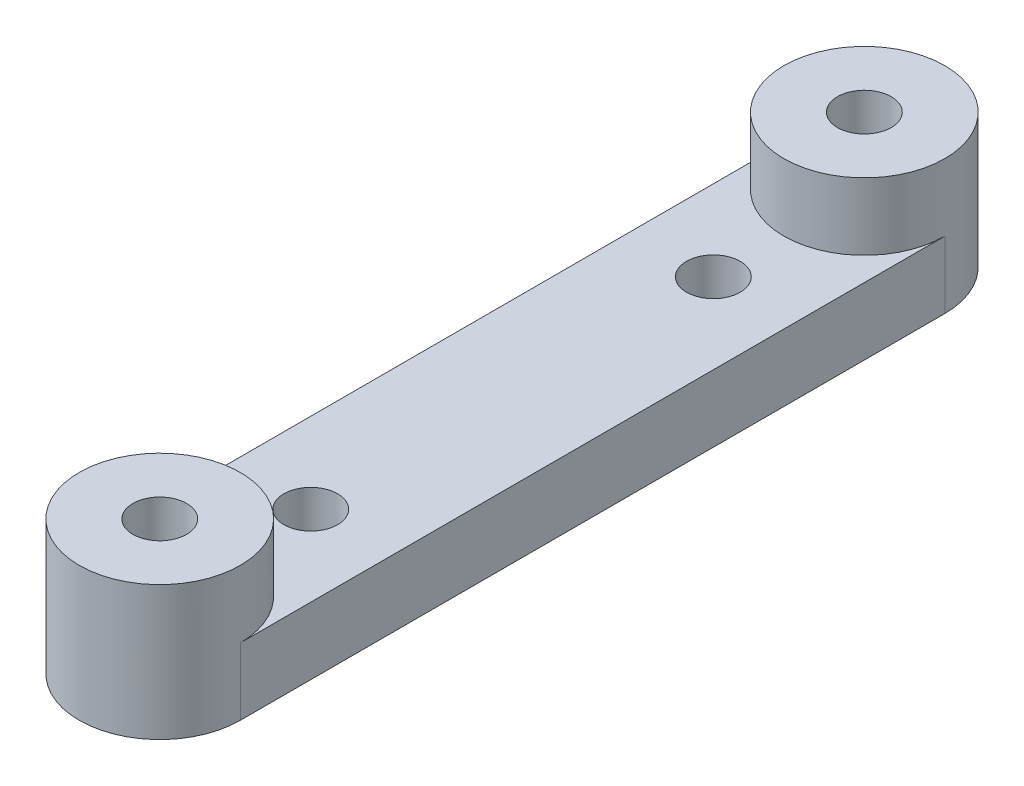
ISO-10303-21;
HEADER;
FILE_DESCRIPTION(('STEP AP214'),'2;1');
FILE_NAME('part.step','',(''),(''),'','','');
FILE_SCHEMA(('AUTOMOTIVE_DESIGN { 1 0 10303 214 1 1 1 1 }'));
ENDSEC;
DATA;
#1=APPLICATION_CONTEXT('core data for automotive mechanical design processes');
#2=APPLICATION_PROTOCOL_DEFINITION('international standard','automotive_design',2000,#1);
#3=PRODUCT_CONTEXT('',#1,'mechanical');
#4=PRODUCT('Part','Part','',(#3));
#5=PRODUCT_RELATED_PRODUCT_CATEGORY('part','',(#4));
#6=PRODUCT_DEFINITION_FORMATION('','',#4);
#7=PRODUCT_DEFINITION_CONTEXT('part definition',#1,'design');
#8=PRODUCT_DEFINITION('design','',#6,#7);
#9=PRODUCT_DEFINITION_SHAPE('','',#8);
#10=(LENGTH_UNIT() NAMED_UNIT(*) SI_UNIT(.MILLI.,.METRE.));
#11=(NAMED_UNIT(*) PLANE_ANGLE_UNIT() SI_UNIT($,.RADIAN.));
#12=(NAMED_UNIT(*) SI_UNIT($,.STERADIAN.) SOLID_ANGLE_UNIT());
#13=UNCERTAINTY_MEASURE_WITH_UNIT(LENGTH_MEASURE(1.E-05),#10,'distance_accuracy_value','');
#14=(GEOMETRIC_REPRESENTATION_CONTEXT(3) GLOBAL_UNCERTAINTY_ASSIGNED_CONTEXT((#13)) GLOBAL_UNIT_ASSIGNED_CONTEXT((#10,
#11,#12)) REPRESENTATION_CONTEXT('',''));
#15=CARTESIAN_POINT('',(0.,0.,0.));
#16=DIRECTION('',(0.,0.,1.));
#17=DIRECTION('',(1.,0.,0.));
#18=AXIS2_PLACEMENT_3D('',#15,#16,#17);
#19=CARTESIAN_POINT('',(0.,0.,-26.25));
#20=DIRECTION('',(0.,1.,0.));
#21=DIRECTION('',(0.,0.,1.));
#22=AXIS2_PLACEMENT_3D('',#19,#20,#21);
#23=CYLINDRICAL_SURFACE('',#22,2.);
#24=CARTESIAN_POINT('',(0.,10.,-26.25));
#25=DIRECTION('',(0.,1.,0.));
#26=DIRECTION('',(0.,0.,1.));
#27=AXIS2_PLACEMENT_3D('',#24,#25,#26);
#28=CIRCLE('',#27,2.);
#29=CARTESIAN_POINT('',(0.,10.,-24.25));
#30=VERTEX_POINT('',#29);
#31=EDGE_CURVE('E264',#30,#30,#28,.T.);
#32=ORIENTED_EDGE('',*,*,#31,.T.);
#33=EDGE_LOOP('',(#32));
#34=FACE_BOUND('',#33,.T.);
#35=CARTESIAN_POINT('',(0.,2.5,-26.25));
#36=DIRECTION('',(0.,-1.,0.));
#37=DIRECTION('',(0.,0.,-1.));
#38=AXIS2_PLACEMENT_3D('',#35,#36,#37);
#39=CIRCLE('',#38,2.);
#40=CARTESIAN_POINT('',(0.,2.5,-28.25));
#41=VERTEX_POINT('',#40);
#42=EDGE_CURVE('E36',#41,#41,#39,.F.);
#43=ORIENTED_EDGE('',*,*,#42,.F.);
#44=EDGE_LOOP('',(#43));
#45=FACE_BOUND('',#44,.T.);
#46=ADVANCED_FACE('F32',(#34,#45),#23,.F.);
#47=CARTESIAN_POINT('',(0.,0.,26.25));
#48=DIRECTION('',(0.,1.,0.));
#49=DIRECTION('',(0.,0.,1.));
#50=AXIS2_PLACEMENT_3D('',#47,#48,#49);
#51=CYLINDRICAL_SURFACE('',#50,2.);
#52=CARTESIAN_POINT('',(0.,10.,26.25));
#53=DIRECTION('',(0.,1.,0.));
#54=DIRECTION('',(0.,0.,1.));
#55=AXIS2_PLACEMENT_3D('',#52,#53,#54);
#56=CIRCLE('',#55,2.);
#57=CARTESIAN_POINT('',(0.,10.,28.25));
#58=VERTEX_POINT('',#57);
#59=EDGE_CURVE('E280',#58,#58,#56,.T.);
#60=ORIENTED_EDGE('',*,*,#59,.T.);
#61=EDGE_LOOP('',(#60));
#62=FACE_BOUND('',#61,.T.);
#63=CARTESIAN_POINT('',(0.,2.5,26.25));
#64=DIRECTION('',(0.,-1.,0.));
#65=DIRECTION('',(0.,0.,-1.));
#66=AXIS2_PLACEMENT_3D('',#63,#64,#65);
#67=CIRCLE('',#66,2.);
#68=CARTESIAN_POINT('',(0.,2.5,24.25));
#69=VERTEX_POINT('',#68);
#70=EDGE_CURVE('E208',#69,#69,#67,.F.);
#71=ORIENTED_EDGE('',*,*,#70,.F.);
#72=EDGE_LOOP('',(#71));
#73=FACE_BOUND('',#72,.T.);
#74=ADVANCED_FACE('F328',(#62,#73),#51,.F.);
#75=CARTESIAN_POINT('',(0.,5.,0.));
#76=DIRECTION('',(0.,-1.,0.));
#77=DIRECTION('',(0.,0.,-1.));
#78=AXIS2_PLACEMENT_3D('',#75,#76,#77);
#79=PLANE('',#78);
#80=CARTESIAN_POINT('',(0.,5.,-15.));
#81=DIRECTION('',(0.,1.,0.));
#82=DIRECTION('',(0.,0.,1.));
#83=AXIS2_PLACEMENT_3D('',#80,#81,#82);
#84=CIRCLE('',#83,2.);
#85=CARTESIAN_POINT('',(0.,5.,-13.));
#86=VERTEX_POINT('',#85);
#87=EDGE_CURVE('E265',#86,#86,#84,.T.);
#88=ORIENTED_EDGE('',*,*,#87,.F.);
#89=EDGE_LOOP('',(#88));
#90=FACE_BOUND('',#89,.T.);
#91=CARTESIAN_POINT('',(0.,5.,15.));
#92=DIRECTION('',(0.,1.,0.));
#93=DIRECTION('',(0.,0.,1.));
#94=AXIS2_PLACEMENT_3D('',#91,#92,#93);
#95=CIRCLE('',#94,2.);
#96=CARTESIAN_POINT('',(0.,5.,17.));
#97=VERTEX_POINT('',#96);
#98=EDGE_CURVE('E271',#97,#97,#95,.T.);
#99=ORIENTED_EDGE('',*,*,#98,.F.);
#100=EDGE_LOOP('',(#99));
#101=FACE_BOUND('',#100,.T.);
#102=CARTESIAN_POINT('',(0.,5.,-26.25));
#103=DIRECTION('',(0.,1.,0.));
#104=DIRECTION('',(0.,0.,1.));
#105=AXIS2_PLACEMENT_3D('',#102,#103,#104);
#106=CIRCLE('',#105,6.);
#107=CARTESIAN_POINT('',(-6.00000000000001,5.,-26.25));
#108=VERTEX_POINT('',#107);
#109=CARTESIAN_POINT('',(6.,5.,-26.25));
#110=VERTEX_POINT('',#109);
#111=EDGE_CURVE('E276',#108,#110,#106,.T.);
#112=ORIENTED_EDGE('',*,*,#111,.F.);
#113=DIRECTION('',(0.,0.,1.));
#114=VECTOR('',#113,1.);
#115=CARTESIAN_POINT('',(-6.,5.,32.25));
#116=LINE('',#115,#114);
#117=CARTESIAN_POINT('',(-6.,5.,26.25));
#118=VERTEX_POINT('',#117);
#119=EDGE_CURVE('E292',#108,#118,#116,.T.);
#120=ORIENTED_EDGE('',*,*,#119,.T.);
#121=CARTESIAN_POINT('',(0.,5.,26.25));
#122=DIRECTION('',(0.,1.,0.));
#123=DIRECTION('',(0.,0.,1.));
#124=AXIS2_PLACEMENT_3D('',#121,#122,#123);
#125=CIRCLE('',#124,6.);
#126=CARTESIAN_POINT('',(6.,5.,26.25));
#127=VERTEX_POINT('',#126);
#128=EDGE_CURVE('E11',#127,#118,#125,.T.);
#129=ORIENTED_EDGE('',*,*,#128,.F.);
#130=DIRECTION('',(0.,0.,-1.));
#131=VECTOR('',#130,1.);
#132=CARTESIAN_POINT('',(6.,5.,32.25));
#133=LINE('',#132,#131);
#134=EDGE_CURVE('E289',#127,#110,#133,.T.);
#135=ORIENTED_EDGE('',*,*,#134,.T.);
#136=EDGE_LOOP('',(#112,#120,#129,#135));
#137=FACE_BOUND('',#136,.T.);
#138=ADVANCED_FACE('F334',(#90,#101,#137),#79,.F.);
#139=CARTESIAN_POINT('',(6.,5.,32.25));
#140=DIRECTION('',(-1.,0.,0.));
#141=DIRECTION('',(0.,0.,1.));
#142=AXIS2_PLACEMENT_3D('',#139,#140,#141);
#143=PLANE('',#142);
#144=DIRECTION('',(0.,0.,-1.));
#145=VECTOR('',#144,1.);
#146=CARTESIAN_POINT('',(6.,0.,32.25));
#147=LINE('',#146,#145);
#148=CARTESIAN_POINT('',(6.,0.,26.25));
#149=VERTEX_POINT('',#148);
#150=CARTESIAN_POINT('',(6.,0.,-26.25));
#151=VERTEX_POINT('',#150);
#152=EDGE_CURVE('E297',#149,#151,#147,.T.);
#153=ORIENTED_EDGE('',*,*,#152,.T.);
#154=DIRECTION('',(0.,-1.,0.));
#155=VECTOR('',#154,1.);
#156=CARTESIAN_POINT('',(6.,5.,-26.25));
#157=LINE('',#156,#155);
#158=EDGE_CURVE('E41',#151,#110,#157,.F.);
#159=ORIENTED_EDGE('',*,*,#158,.T.);
#160=ORIENTED_EDGE('',*,*,#134,.F.);
#161=DIRECTION('',(0.,-1.,0.));
#162=VECTOR('',#161,1.);
#163=CARTESIAN_POINT('',(6.,5.,26.25));
#164=LINE('',#163,#162);
#165=EDGE_CURVE('E315',#127,#149,#164,.T.);
#166=ORIENTED_EDGE('',*,*,#165,.T.);
#167=EDGE_LOOP('',(#153,#159,#160,#166));
#168=FACE_BOUND('',#167,.T.);
#169=ADVANCED_FACE('F341',(#168),#143,.F.);
#170=CARTESIAN_POINT('',(-6.,5.,32.25));
#171=DIRECTION('',(1.,0.,0.));
#172=DIRECTION('',(0.,0.,-1.));
#173=AXIS2_PLACEMENT_3D('',#170,#171,#172);
#174=PLANE('',#173);
#175=ORIENTED_EDGE('',*,*,#119,.F.);
#176=DIRECTION('',(0.,-1.,0.));
#177=VECTOR('',#176,1.);
#178=CARTESIAN_POINT('',(-6.,5.,-26.25));
#179=LINE('',#178,#177);
#180=CARTESIAN_POINT('',(-6.,0.,-26.25));
#181=VERTEX_POINT('',#180);
#182=EDGE_CURVE('E304',#108,#181,#179,.T.);
#183=ORIENTED_EDGE('',*,*,#182,.T.);
#184=DIRECTION('',(0.,0.,1.));
#185=VECTOR('',#184,1.);
#186=CARTESIAN_POINT('',(-6.,0.,32.25));
#187=LINE('',#186,#185);
#188=CARTESIAN_POINT('',(-6.,0.,26.25));
#189=VERTEX_POINT('',#188);
#190=EDGE_CURVE('E293',#181,#189,#187,.T.);
#191=ORIENTED_EDGE('',*,*,#190,.T.);
#192=DIRECTION('',(0.,-1.,0.));
#193=VECTOR('',#192,1.);
#194=CARTESIAN_POINT('',(-6.,5.,26.25));
#195=LINE('',#194,#193);
#196=EDGE_CURVE('E296',#189,#118,#195,.F.);
#197=ORIENTED_EDGE('',*,*,#196,.T.);
#198=EDGE_LOOP('',(#175,#183,#191,#197));
#199=FACE_BOUND('',#198,.T.);
#200=ADVANCED_FACE('F347',(#199),#174,.F.);
#201=CARTESIAN_POINT('',(0.,0.,0.));
#202=DIRECTION('',(0.,-1.,0.));
#203=DIRECTION('',(0.,0.,-1.));
#204=AXIS2_PLACEMENT_3D('',#201,#202,#203);
#205=PLANE('',#204);
#206=DIRECTION('',(0.5,0.,0.866025403784439));
#207=VECTOR('',#206,1.);
#208=CARTESIAN_POINT('',(2.3094010767585,0.,22.25));
#209=LINE('',#208,#207);
#210=CARTESIAN_POINT('',(2.3094010767585,0.,22.25));
#211=VERTEX_POINT('',#210);
#212=CARTESIAN_POINT('',(4.61880215351701,0.,26.25));
#213=VERTEX_POINT('',#212);
#214=EDGE_CURVE('E49',#211,#213,#209,.T.);
#215=ORIENTED_EDGE('',*,*,#214,.F.);
#216=DIRECTION('',(1.,0.,0.));
#217=VECTOR('',#216,1.);
#218=CARTESIAN_POINT('',(-2.3094010767585,0.,22.25));
#219=LINE('',#218,#217);
#220=CARTESIAN_POINT('',(-2.3094010767585,0.,22.25));
#221=VERTEX_POINT('',#220);
#222=EDGE_CURVE('E181',#221,#211,#219,.T.);
#223=ORIENTED_EDGE('',*,*,#222,.F.);
#224=DIRECTION('',(0.499999999999999,0.,-0.866025403784439));
#225=VECTOR('',#224,1.);
#226=CARTESIAN_POINT('',(-4.618802153517,0.,26.25));
#227=LINE('',#226,#225);
#228=CARTESIAN_POINT('',(-4.618802153517,0.,26.25));
#229=VERTEX_POINT('',#228);
#230=EDGE_CURVE('E184',#229,#221,#227,.T.);
#231=ORIENTED_EDGE('',*,*,#230,.F.);
#232=DIRECTION('',(-0.5,0.,-0.866025403784439));
#233=VECTOR('',#232,1.);
#234=CARTESIAN_POINT('',(-2.3094010767585,0.,30.25));
#235=LINE('',#234,#233);
#236=CARTESIAN_POINT('',(-2.3094010767585,0.,30.25));
#237=VERTEX_POINT('',#236);
#238=EDGE_CURVE('E201',#237,#229,#235,.T.);
#239=ORIENTED_EDGE('',*,*,#238,.F.);
#240=DIRECTION('',(-1.,0.,0.));
#241=VECTOR('',#240,1.);
#242=CARTESIAN_POINT('',(2.3094010767585,0.,30.25));
#243=LINE('',#242,#241);
#244=CARTESIAN_POINT('',(2.3094010767585,0.,30.25));
#245=VERTEX_POINT('',#244);
#246=EDGE_CURVE('E198',#245,#237,#243,.T.);
#247=ORIENTED_EDGE('',*,*,#246,.F.);
#248=DIRECTION('',(-0.5,0.,0.866025403784439));
#249=VECTOR('',#248,1.);
#250=CARTESIAN_POINT('',(4.61880215351701,0.,26.25));
#251=LINE('',#250,#249);
#252=EDGE_CURVE('E195',#213,#245,#251,.T.);
#253=ORIENTED_EDGE('',*,*,#252,.F.);
#254=EDGE_LOOP('',(#215,#223,#231,#239,#247,#253));
#255=FACE_BOUND('',#254,.T.);
#256=DIRECTION('',(-0.5,0.,0.866025403784438));
#257=VECTOR('',#256,1.);
#258=CARTESIAN_POINT('',(4.61880215351701,0.,-26.25));
#259=LINE('',#258,#257);
#260=CARTESIAN_POINT('',(4.61880215351701,0.,-26.25));
#261=VERTEX_POINT('',#260);
#262=CARTESIAN_POINT('',(2.3094010767585,0.,-22.25));
#263=VERTEX_POINT('',#262);
#264=EDGE_CURVE('E57',#261,#263,#259,.T.);
#265=ORIENTED_EDGE('',*,*,#264,.F.);
#266=DIRECTION('',(0.499999999999999,0.,0.866025403784439));
#267=VECTOR('',#266,1.);
#268=CARTESIAN_POINT('',(2.3094010767585,0.,-30.25));
#269=LINE('',#268,#267);
#270=CARTESIAN_POINT('',(2.3094010767585,0.,-30.25));
#271=VERTEX_POINT('',#270);
#272=EDGE_CURVE('E220',#271,#261,#269,.T.);
#273=ORIENTED_EDGE('',*,*,#272,.F.);
#274=DIRECTION('',(1.,0.,0.));
#275=VECTOR('',#274,1.);
#276=CARTESIAN_POINT('',(-2.30940107675854,0.,-30.25));
#277=LINE('',#276,#275);
#278=CARTESIAN_POINT('',(-2.30940107675854,0.,-30.25));
#279=VERTEX_POINT('',#278);
#280=EDGE_CURVE('E246',#279,#271,#277,.T.);
#281=ORIENTED_EDGE('',*,*,#280,.F.);
#282=DIRECTION('',(0.499999999999996,0.,-0.866025403784441));
#283=VECTOR('',#282,1.);
#284=CARTESIAN_POINT('',(-4.61880215351702,0.,-26.25));
#285=LINE('',#284,#283);
#286=CARTESIAN_POINT('',(-4.61880215351702,0.,-26.25));
#287=VERTEX_POINT('',#286);
#288=EDGE_CURVE('E243',#287,#279,#285,.T.);
#289=ORIENTED_EDGE('',*,*,#288,.F.);
#290=DIRECTION('',(-0.499999999999999,0.,-0.866025403784439));
#291=VECTOR('',#290,1.);
#292=CARTESIAN_POINT('',(-2.30940107675851,0.,-22.25));
#293=LINE('',#292,#291);
#294=CARTESIAN_POINT('',(-2.30940107675851,0.,-22.25));
#295=VERTEX_POINT('',#294);
#296=EDGE_CURVE('E240',#295,#287,#293,.T.);
#297=ORIENTED_EDGE('',*,*,#296,.F.);
#298=DIRECTION('',(-1.,0.,0.));
#299=VECTOR('',#298,1.);
#300=CARTESIAN_POINT('',(2.3094010767585,0.,-22.25));
#301=LINE('',#300,#299);
#302=EDGE_CURVE('E237',#263,#295,#301,.T.);
#303=ORIENTED_EDGE('',*,*,#302,.F.);
#304=EDGE_LOOP('',(#265,#273,#281,#289,#297,#303));
#305=FACE_BOUND('',#304,.T.);
#306=CARTESIAN_POINT('',(0.,0.,-15.));
#307=DIRECTION('',(0.,1.,0.));
#308=DIRECTION('',(0.,0.,1.));
#309=AXIS2_PLACEMENT_3D('',#306,#307,#308);
#310=CIRCLE('',#309,2.);
#311=CARTESIAN_POINT('',(0.,0.,-13.));
#312=VERTEX_POINT('',#311);
#313=EDGE_CURVE('E261',#312,#312,#310,.T.);
#314=ORIENTED_EDGE('',*,*,#313,.T.);
#315=EDGE_LOOP('',(#314));
#316=FACE_BOUND('',#315,.T.);
#317=CARTESIAN_POINT('',(0.,0.,15.));
#318=DIRECTION('',(0.,1.,0.));
#319=DIRECTION('',(0.,0.,1.));
#320=AXIS2_PLACEMENT_3D('',#317,#318,#319);
#321=CIRCLE('',#320,2.);
#322=CARTESIAN_POINT('',(0.,0.,17.));
#323=VERTEX_POINT('',#322);
#324=EDGE_CURVE('E268',#323,#323,#321,.T.);
#325=ORIENTED_EDGE('',*,*,#324,.T.);
#326=EDGE_LOOP('',(#325));
#327=FACE_BOUND('',#326,.T.);
#328=ORIENTED_EDGE('',*,*,#190,.F.);
#329=CARTESIAN_POINT('',(0.,0.,-26.25));
#330=DIRECTION('',(0.,-1.,0.));
#331=DIRECTION('',(0.,0.,-1.));
#332=AXIS2_PLACEMENT_3D('',#329,#330,#331);
#333=CIRCLE('',#332,6.);
#334=CARTESIAN_POINT('',(0.,0.,-32.25));
#335=VERTEX_POINT('',#334);
#336=EDGE_CURVE('E313',#181,#335,#333,.T.);
#337=ORIENTED_EDGE('',*,*,#336,.T.);
#338=CARTESIAN_POINT('',(0.,0.,-26.25));
#339=DIRECTION('',(0.,-1.,0.));
#340=DIRECTION('',(0.,0.,-1.));
#341=AXIS2_PLACEMENT_3D('',#338,#339,#340);
#342=CIRCLE('',#341,6.);
#343=EDGE_CURVE('E311',#335,#151,#342,.T.);
#344=ORIENTED_EDGE('',*,*,#343,.T.);
#345=ORIENTED_EDGE('',*,*,#152,.F.);
#346=CARTESIAN_POINT('',(0.,0.,26.25));
#347=DIRECTION('',(0.,-1.,0.));
#348=DIRECTION('',(0.,0.,-1.));
#349=AXIS2_PLACEMENT_3D('',#346,#347,#348);
#350=CIRCLE('',#349,6.);
#351=CARTESIAN_POINT('',(0.,0.,32.25));
#352=VERTEX_POINT('',#351);
#353=EDGE_CURVE('E307',#149,#352,#350,.T.);
#354=ORIENTED_EDGE('',*,*,#353,.T.);
#355=CARTESIAN_POINT('',(0.,0.,26.25));
#356=DIRECTION('',(0.,-1.,0.));
#357=DIRECTION('',(0.,0.,-1.));
#358=AXIS2_PLACEMENT_3D('',#355,#356,#357);
#359=CIRCLE('',#358,6.);
#360=EDGE_CURVE('E309',#352,#189,#359,.T.);
#361=ORIENTED_EDGE('',*,*,#360,.T.);
#362=EDGE_LOOP('',(#328,#337,#344,#345,#354,#361));
#363=FACE_BOUND('',#362,.T.);
#364=ADVANCED_FACE('F343',(#255,#305,#316,#327,#363),#205,.T.);
#365=CARTESIAN_POINT('',(0.,5.,-26.25));
#366=DIRECTION('',(0.,-1.,0.));
#367=DIRECTION('',(0.,0.,-1.));
#368=AXIS2_PLACEMENT_3D('',#365,#366,#367);
#369=CYLINDRICAL_SURFACE('',#368,6.);
#370=DIRECTION('',(0.,-1.,0.));
#371=VECTOR('',#370,1.);
#372=CARTESIAN_POINT('',(0.,5.,-32.25));
#373=LINE('',#372,#371);
#374=CARTESIAN_POINT('',(0.,5.,-32.25));
#375=VERTEX_POINT('',#374);
#376=EDGE_CURVE('E300',#375,#335,#373,.T.);
#377=ORIENTED_EDGE('',*,*,#376,.F.);
#378=ORIENTED_EDGE('',*,*,#376,.T.);
#379=ORIENTED_EDGE('',*,*,#336,.F.);
#380=ORIENTED_EDGE('',*,*,#182,.F.);
#381=ORIENTED_EDGE('',*,*,#111,.T.);
#382=ORIENTED_EDGE('',*,*,#158,.F.);
#383=ORIENTED_EDGE('',*,*,#343,.F.);
#384=EDGE_LOOP('',(#377,#378,#379,#380,#381,#382,#383));
#385=FACE_BOUND('',#384,.T.);
#386=CARTESIAN_POINT('',(0.,10.,-26.25));
#387=DIRECTION('',(0.,1.,0.));
#388=DIRECTION('',(0.,0.,1.));
#389=AXIS2_PLACEMENT_3D('',#386,#387,#388);
#390=CIRCLE('',#389,6.);
#391=CARTESIAN_POINT('',(0.,10.,-20.25));
#392=VERTEX_POINT('',#391);
#393=EDGE_CURVE('E277',#392,#392,#390,.T.);
#394=ORIENTED_EDGE('',*,*,#393,.F.);
#395=EDGE_LOOP('',(#394));
#396=FACE_BOUND('',#395,.T.);
#397=ADVANCED_FACE('F346',(#385,#396),#369,.T.);
#398=CARTESIAN_POINT('',(0.,5.,26.25));
#399=DIRECTION('',(0.,-1.,0.));
#400=DIRECTION('',(0.,0.,-1.));
#401=AXIS2_PLACEMENT_3D('',#398,#399,#400);
#402=CYLINDRICAL_SURFACE('',#401,6.);
#403=ORIENTED_EDGE('',*,*,#165,.F.);
#404=ORIENTED_EDGE('',*,*,#128,.T.);
#405=ORIENTED_EDGE('',*,*,#196,.F.);
#406=ORIENTED_EDGE('',*,*,#360,.F.);
#407=DIRECTION('',(0.,-1.,0.));
#408=VECTOR('',#407,1.);
#409=CARTESIAN_POINT('',(0.,5.,32.25));
#410=LINE('',#409,#408);
#411=CARTESIAN_POINT('',(0.,5.,32.25));
#412=VERTEX_POINT('',#411);
#413=EDGE_CURVE('E287',#352,#412,#410,.F.);
#414=ORIENTED_EDGE('',*,*,#413,.T.);
#415=ORIENTED_EDGE('',*,*,#413,.F.);
#416=ORIENTED_EDGE('',*,*,#353,.F.);
#417=EDGE_LOOP('',(#403,#404,#405,#406,#414,#415,#416));
#418=FACE_BOUND('',#417,.T.);
#419=CARTESIAN_POINT('',(0.,10.,26.25));
#420=DIRECTION('',(0.,1.,0.));
#421=DIRECTION('',(0.,0.,1.));
#422=AXIS2_PLACEMENT_3D('',#419,#420,#421);
#423=CIRCLE('',#422,6.);
#424=CARTESIAN_POINT('',(0.,10.,32.25));
#425=VERTEX_POINT('',#424);
#426=EDGE_CURVE('E285',#425,#425,#423,.T.);
#427=ORIENTED_EDGE('',*,*,#426,.F.);
#428=EDGE_LOOP('',(#427));
#429=FACE_BOUND('',#428,.T.);
#430=ADVANCED_FACE('F34',(#418,#429),#402,.T.);
#431=CARTESIAN_POINT('',(0.,10.,26.25));
#432=DIRECTION('',(0.,1.,0.));
#433=DIRECTION('',(0.,0.,1.));
#434=AXIS2_PLACEMENT_3D('',#431,#432,#433);
#435=PLANE('',#434);
#436=ORIENTED_EDGE('',*,*,#426,.T.);
#437=EDGE_LOOP('',(#436));
#438=FACE_BOUND('',#437,.T.);
#439=ORIENTED_EDGE('',*,*,#59,.F.);
#440=EDGE_LOOP('',(#439));
#441=FACE_BOUND('',#440,.T.);
#442=ADVANCED_FACE('F359',(#438,#441),#435,.T.);
#443=CARTESIAN_POINT('',(0.,10.,-26.25));
#444=DIRECTION('',(0.,1.,0.));
#445=DIRECTION('',(0.,0.,1.));
#446=AXIS2_PLACEMENT_3D('',#443,#444,#445);
#447=PLANE('',#446);
#448=ORIENTED_EDGE('',*,*,#393,.T.);
#449=EDGE_LOOP('',(#448));
#450=FACE_BOUND('',#449,.T.);
#451=ORIENTED_EDGE('',*,*,#31,.F.);
#452=EDGE_LOOP('',(#451));
#453=FACE_BOUND('',#452,.T.);
#454=ADVANCED_FACE('F365',(#450,#453),#447,.T.);
#455=CARTESIAN_POINT('',(0.,0.,15.));
#456=DIRECTION('',(0.,1.,0.));
#457=DIRECTION('',(0.,0.,1.));
#458=AXIS2_PLACEMENT_3D('',#455,#456,#457);
#459=CYLINDRICAL_SURFACE('',#458,2.);
#460=ORIENTED_EDGE('',*,*,#324,.F.);
#461=EDGE_LOOP('',(#460));
#462=FACE_BOUND('',#461,.T.);
#463=ORIENTED_EDGE('',*,*,#98,.T.);
#464=EDGE_LOOP('',(#463));
#465=FACE_BOUND('',#464,.T.);
#466=ADVANCED_FACE('F368',(#462,#465),#459,.F.);
#467=CARTESIAN_POINT('',(0.,0.,-15.));
#468=DIRECTION('',(0.,1.,0.));
#469=DIRECTION('',(0.,0.,1.));
#470=AXIS2_PLACEMENT_3D('',#467,#468,#469);
#471=CYLINDRICAL_SURFACE('',#470,2.);
#472=ORIENTED_EDGE('',*,*,#313,.F.);
#473=EDGE_LOOP('',(#472));
#474=FACE_BOUND('',#473,.T.);
#475=ORIENTED_EDGE('',*,*,#87,.T.);
#476=EDGE_LOOP('',(#475));
#477=FACE_BOUND('',#476,.T.);
#478=ADVANCED_FACE('F375',(#474,#477),#471,.F.);
#479=CARTESIAN_POINT('',(0.,2.5,0.));
#480=DIRECTION('',(0.,-1.,0.));
#481=DIRECTION('',(0.,0.,-1.));
#482=AXIS2_PLACEMENT_3D('',#479,#480,#481);
#483=PLANE('',#482);
#484=DIRECTION('',(0.5,0.,0.866025403784439));
#485=VECTOR('',#484,1.);
#486=CARTESIAN_POINT('',(2.3094010767585,2.5,22.25));
#487=LINE('',#486,#485);
#488=CARTESIAN_POINT('',(2.3094010767585,2.5,22.25));
#489=VERTEX_POINT('',#488);
#490=CARTESIAN_POINT('',(4.61880215351701,2.5,26.25));
#491=VERTEX_POINT('',#490);
#492=EDGE_CURVE('E161',#489,#491,#487,.T.);
#493=ORIENTED_EDGE('',*,*,#492,.T.);
#494=DIRECTION('',(-0.5,0.,0.866025403784439));
#495=VECTOR('',#494,1.);
#496=CARTESIAN_POINT('',(4.61880215351701,2.5,26.25));
#497=LINE('',#496,#495);
#498=CARTESIAN_POINT('',(2.3094010767585,2.5,30.25));
#499=VERTEX_POINT('',#498);
#500=EDGE_CURVE('E170',#491,#499,#497,.T.);
#501=ORIENTED_EDGE('',*,*,#500,.T.);
#502=DIRECTION('',(-1.,0.,0.));
#503=VECTOR('',#502,1.);
#504=CARTESIAN_POINT('',(2.3094010767585,2.5,30.25));
#505=LINE('',#504,#503);
#506=CARTESIAN_POINT('',(-2.3094010767585,2.5,30.25));
#507=VERTEX_POINT('',#506);
#508=EDGE_CURVE('E175',#499,#507,#505,.T.);
#509=ORIENTED_EDGE('',*,*,#508,.T.);
#510=DIRECTION('',(-0.5,0.,-0.866025403784439));
#511=VECTOR('',#510,1.);
#512=CARTESIAN_POINT('',(-2.3094010767585,2.5,30.25));
#513=LINE('',#512,#511);
#514=CARTESIAN_POINT('',(-4.618802153517,2.5,26.25));
#515=VERTEX_POINT('',#514);
#516=EDGE_CURVE('E188',#507,#515,#513,.T.);
#517=ORIENTED_EDGE('',*,*,#516,.T.);
#518=DIRECTION('',(0.499999999999999,0.,-0.866025403784439));
#519=VECTOR('',#518,1.);
#520=CARTESIAN_POINT('',(-4.618802153517,2.5,26.25));
#521=LINE('',#520,#519);
#522=CARTESIAN_POINT('',(-2.3094010767585,2.5,22.25));
#523=VERTEX_POINT('',#522);
#524=EDGE_CURVE('E191',#515,#523,#521,.T.);
#525=ORIENTED_EDGE('',*,*,#524,.T.);
#526=DIRECTION('',(1.,0.,0.));
#527=VECTOR('',#526,1.);
#528=CARTESIAN_POINT('',(-2.3094010767585,2.5,22.25));
#529=LINE('',#528,#527);
#530=EDGE_CURVE('E167',#523,#489,#529,.T.);
#531=ORIENTED_EDGE('',*,*,#530,.T.);
#532=EDGE_LOOP('',(#493,#501,#509,#517,#525,#531));
#533=FACE_BOUND('',#532,.T.);
#534=ORIENTED_EDGE('',*,*,#70,.T.);
#535=EDGE_LOOP('',(#534));
#536=FACE_BOUND('',#535,.T.);
#537=ADVANCED_FACE('F177',(#533,#536),#483,.T.);
#538=CARTESIAN_POINT('',(2.3094010767585,2.5,22.25));
#539=DIRECTION('',(0.866025403784438,0.,-0.5));
#540=DIRECTION('',(-0.5,0.,-0.866025403784438));
#541=AXIS2_PLACEMENT_3D('',#538,#539,#540);
#542=PLANE('',#541);
#543=ORIENTED_EDGE('',*,*,#214,.T.);
#544=DIRECTION('',(0.,-1.,0.));
#545=VECTOR('',#544,1.);
#546=CARTESIAN_POINT('',(4.61880215351701,2.5,26.25));
#547=LINE('',#546,#545);
#548=EDGE_CURVE('E157',#491,#213,#547,.T.);
#549=ORIENTED_EDGE('',*,*,#548,.F.);
#550=ORIENTED_EDGE('',*,*,#492,.F.);
#551=DIRECTION('',(0.,-1.,0.));
#552=VECTOR('',#551,1.);
#553=CARTESIAN_POINT('',(2.3094010767585,2.5,22.25));
#554=LINE('',#553,#552);
#555=EDGE_CURVE('E206',#489,#211,#554,.T.);
#556=ORIENTED_EDGE('',*,*,#555,.T.);
#557=EDGE_LOOP('',(#543,#549,#550,#556));
#558=FACE_BOUND('',#557,.T.);
#559=ADVANCED_FACE('F159',(#558),#542,.F.);
#560=CARTESIAN_POINT('',(-2.3094010767585,2.5,22.25));
#561=DIRECTION('',(0.,0.,-1.));
#562=DIRECTION('',(-1.,0.,0.));
#563=AXIS2_PLACEMENT_3D('',#560,#561,#562);
#564=PLANE('',#563);
#565=ORIENTED_EDGE('',*,*,#222,.T.);
#566=ORIENTED_EDGE('',*,*,#555,.F.);
#567=ORIENTED_EDGE('',*,*,#530,.F.);
#568=DIRECTION('',(0.,-1.,0.));
#569=VECTOR('',#568,1.);
#570=CARTESIAN_POINT('',(-2.3094010767585,2.5,22.25));
#571=LINE('',#570,#569);
#572=EDGE_CURVE('E209',#523,#221,#571,.T.);
#573=ORIENTED_EDGE('',*,*,#572,.T.);
#574=EDGE_LOOP('',(#565,#566,#567,#573));
#575=FACE_BOUND('',#574,.T.);
#576=ADVANCED_FACE('F411',(#575),#564,.F.);
#577=CARTESIAN_POINT('',(-4.618802153517,2.5,26.25));
#578=DIRECTION('',(-0.866025403784439,0.,-0.5));
#579=DIRECTION('',(-0.5,0.,0.866025403784439));
#580=AXIS2_PLACEMENT_3D('',#577,#578,#579);
#581=PLANE('',#580);
#582=ORIENTED_EDGE('',*,*,#230,.T.);
#583=ORIENTED_EDGE('',*,*,#572,.F.);
#584=ORIENTED_EDGE('',*,*,#524,.F.);
#585=DIRECTION('',(0.,-1.,0.));
#586=VECTOR('',#585,1.);
#587=CARTESIAN_POINT('',(-4.618802153517,2.5,26.25));
#588=LINE('',#587,#586);
#589=EDGE_CURVE('E211',#515,#229,#588,.T.);
#590=ORIENTED_EDGE('',*,*,#589,.T.);
#591=EDGE_LOOP('',(#582,#583,#584,#590));
#592=FACE_BOUND('',#591,.T.);
#593=ADVANCED_FACE('F421',(#592),#581,.F.);
#594=CARTESIAN_POINT('',(-2.3094010767585,2.5,30.25));
#595=DIRECTION('',(-0.866025403784438,0.,0.5));
#596=DIRECTION('',(0.5,0.,0.866025403784438));
#597=AXIS2_PLACEMENT_3D('',#594,#595,#596);
#598=PLANE('',#597);
#599=ORIENTED_EDGE('',*,*,#238,.T.);
#600=ORIENTED_EDGE('',*,*,#589,.F.);
#601=ORIENTED_EDGE('',*,*,#516,.F.);
#602=DIRECTION('',(0.,-1.,0.));
#603=VECTOR('',#602,1.);
#604=CARTESIAN_POINT('',(-2.3094010767585,2.5,30.25));
#605=LINE('',#604,#603);
#606=EDGE_CURVE('E213',#507,#237,#605,.T.);
#607=ORIENTED_EDGE('',*,*,#606,.T.);
#608=EDGE_LOOP('',(#599,#600,#601,#607));
#609=FACE_BOUND('',#608,.T.);
#610=ADVANCED_FACE('F417',(#609),#598,.F.);
#611=CARTESIAN_POINT('',(2.3094010767585,2.5,30.25));
#612=DIRECTION('',(0.,0.,1.));
#613=DIRECTION('',(1.,0.,0.));
#614=AXIS2_PLACEMENT_3D('',#611,#612,#613);
#615=PLANE('',#614);
#616=ORIENTED_EDGE('',*,*,#246,.T.);
#617=ORIENTED_EDGE('',*,*,#606,.F.);
#618=ORIENTED_EDGE('',*,*,#508,.F.);
#619=DIRECTION('',(0.,-1.,0.));
#620=VECTOR('',#619,1.);
#621=CARTESIAN_POINT('',(2.3094010767585,2.5,30.25));
#622=LINE('',#621,#620);
#623=EDGE_CURVE('E166',#499,#245,#622,.T.);
#624=ORIENTED_EDGE('',*,*,#623,.T.);
#625=EDGE_LOOP('',(#616,#617,#618,#624));
#626=FACE_BOUND('',#625,.T.);
#627=ADVANCED_FACE('F414',(#626),#615,.F.);
#628=CARTESIAN_POINT('',(4.61880215351701,2.5,26.25));
#629=DIRECTION('',(0.866025403784439,0.,0.5));
#630=DIRECTION('',(0.5,0.,-0.866025403784439));
#631=AXIS2_PLACEMENT_3D('',#628,#629,#630);
#632=PLANE('',#631);
#633=ORIENTED_EDGE('',*,*,#252,.T.);
#634=ORIENTED_EDGE('',*,*,#623,.F.);
#635=ORIENTED_EDGE('',*,*,#500,.F.);
#636=ORIENTED_EDGE('',*,*,#548,.T.);
#637=EDGE_LOOP('',(#633,#634,#635,#636));
#638=FACE_BOUND('',#637,.T.);
#639=ADVANCED_FACE('F171',(#638),#632,.F.);
#640=CARTESIAN_POINT('',(0.,2.5,0.));
#641=DIRECTION('',(0.,-1.,0.));
#642=DIRECTION('',(0.,0.,-1.));
#643=AXIS2_PLACEMENT_3D('',#640,#641,#642);
#644=PLANE('',#643);
#645=DIRECTION('',(-0.5,0.,0.866025403784438));
#646=VECTOR('',#645,1.);
#647=CARTESIAN_POINT('',(4.61880215351701,2.5,-26.25));
#648=LINE('',#647,#646);
#649=CARTESIAN_POINT('',(4.61880215351701,2.5,-26.25));
#650=VERTEX_POINT('',#649);
#651=CARTESIAN_POINT('',(2.3094010767585,2.5,-22.25));
#652=VERTEX_POINT('',#651);
#653=EDGE_CURVE('E216',#650,#652,#648,.T.);
#654=ORIENTED_EDGE('',*,*,#653,.T.);
#655=DIRECTION('',(-1.,0.,0.));
#656=VECTOR('',#655,1.);
#657=CARTESIAN_POINT('',(2.3094010767585,2.5,-22.25));
#658=LINE('',#657,#656);
#659=CARTESIAN_POINT('',(-2.30940107675851,2.5,-22.25));
#660=VERTEX_POINT('',#659);
#661=EDGE_CURVE('E219',#652,#660,#658,.T.);
#662=ORIENTED_EDGE('',*,*,#661,.T.);
#663=DIRECTION('',(-0.499999999999999,0.,-0.866025403784439));
#664=VECTOR('',#663,1.);
#665=CARTESIAN_POINT('',(-2.30940107675851,2.5,-22.25));
#666=LINE('',#665,#664);
#667=CARTESIAN_POINT('',(-4.61880215351702,2.5,-26.25));
#668=VERTEX_POINT('',#667);
#669=EDGE_CURVE('E223',#660,#668,#666,.T.);
#670=ORIENTED_EDGE('',*,*,#669,.T.);
#671=DIRECTION('',(0.499999999999996,0.,-0.866025403784441));
#672=VECTOR('',#671,1.);
#673=CARTESIAN_POINT('',(-4.61880215351702,2.5,-26.25));
#674=LINE('',#673,#672);
#675=CARTESIAN_POINT('',(-2.30940107675854,2.5,-30.25));
#676=VERTEX_POINT('',#675);
#677=EDGE_CURVE('E226',#668,#676,#674,.T.);
#678=ORIENTED_EDGE('',*,*,#677,.T.);
#679=DIRECTION('',(1.,0.,0.));
#680=VECTOR('',#679,1.);
#681=CARTESIAN_POINT('',(-2.30940107675854,2.5,-30.25));
#682=LINE('',#681,#680);
#683=CARTESIAN_POINT('',(2.3094010767585,2.5,-30.25));
#684=VERTEX_POINT('',#683);
#685=EDGE_CURVE('E229',#676,#684,#682,.T.);
#686=ORIENTED_EDGE('',*,*,#685,.T.);
#687=DIRECTION('',(0.499999999999999,0.,0.866025403784439));
#688=VECTOR('',#687,1.);
#689=CARTESIAN_POINT('',(2.3094010767585,2.5,-30.25));
#690=LINE('',#689,#688);
#691=EDGE_CURVE('E232',#684,#650,#690,.T.);
#692=ORIENTED_EDGE('',*,*,#691,.T.);
#693=EDGE_LOOP('',(#654,#662,#670,#678,#686,#692));
#694=FACE_BOUND('',#693,.T.);
#695=ORIENTED_EDGE('',*,*,#42,.T.);
#696=EDGE_LOOP('',(#695));
#697=FACE_BOUND('',#696,.T.);
#698=ADVANCED_FACE('F325',(#694,#697),#644,.T.);
#699=CARTESIAN_POINT('',(4.61880215351701,2.5,-26.25));
#700=DIRECTION('',(0.866025403784438,0.,0.5));
#701=DIRECTION('',(0.5,0.,-0.866025403784438));
#702=AXIS2_PLACEMENT_3D('',#699,#700,#701);
#703=PLANE('',#702);
#704=ORIENTED_EDGE('',*,*,#264,.T.);
#705=DIRECTION('',(0.,-1.,0.));
#706=VECTOR('',#705,1.);
#707=CARTESIAN_POINT('',(2.3094010767585,2.5,-22.25));
#708=LINE('',#707,#706);
#709=EDGE_CURVE('E235',#652,#263,#708,.T.);
#710=ORIENTED_EDGE('',*,*,#709,.F.);
#711=ORIENTED_EDGE('',*,*,#653,.F.);
#712=DIRECTION('',(0.,-1.,0.));
#713=VECTOR('',#712,1.);
#714=CARTESIAN_POINT('',(4.61880215351701,2.5,-26.25));
#715=LINE('',#714,#713);
#716=EDGE_CURVE('E196',#650,#261,#715,.T.);
#717=ORIENTED_EDGE('',*,*,#716,.T.);
#718=EDGE_LOOP('',(#704,#710,#711,#717));
#719=FACE_BOUND('',#718,.T.);
#720=ADVANCED_FACE('F383',(#719),#703,.F.);
#721=CARTESIAN_POINT('',(2.3094010767585,2.5,-30.25));
#722=DIRECTION('',(0.866025403784439,0.,-0.499999999999999));
#723=DIRECTION('',(-0.499999999999999,0.,-0.866025403784439));
#724=AXIS2_PLACEMENT_3D('',#721,#722,#723);
#725=PLANE('',#724);
#726=ORIENTED_EDGE('',*,*,#272,.T.);
#727=ORIENTED_EDGE('',*,*,#716,.F.);
#728=ORIENTED_EDGE('',*,*,#691,.F.);
#729=DIRECTION('',(0.,-1.,0.));
#730=VECTOR('',#729,1.);
#731=CARTESIAN_POINT('',(2.3094010767585,2.5,-30.25));
#732=LINE('',#731,#730);
#733=EDGE_CURVE('E252',#684,#271,#732,.T.);
#734=ORIENTED_EDGE('',*,*,#733,.T.);
#735=EDGE_LOOP('',(#726,#727,#728,#734));
#736=FACE_BOUND('',#735,.T.);
#737=ADVANCED_FACE('F386',(#736),#725,.F.);
#738=CARTESIAN_POINT('',(-2.30940107675854,2.5,-30.25));
#739=DIRECTION('',(0.,0.,-1.));
#740=DIRECTION('',(-1.,0.,0.));
#741=AXIS2_PLACEMENT_3D('',#738,#739,#740);
#742=PLANE('',#741);
#743=ORIENTED_EDGE('',*,*,#280,.T.);
#744=ORIENTED_EDGE('',*,*,#733,.F.);
#745=ORIENTED_EDGE('',*,*,#685,.F.);
#746=DIRECTION('',(0.,-1.,0.));
#747=VECTOR('',#746,1.);
#748=CARTESIAN_POINT('',(-2.30940107675854,2.5,-30.25));
#749=LINE('',#748,#747);
#750=EDGE_CURVE('E254',#676,#279,#749,.T.);
#751=ORIENTED_EDGE('',*,*,#750,.T.);
#752=EDGE_LOOP('',(#743,#744,#745,#751));
#753=FACE_BOUND('',#752,.T.);
#754=ADVANCED_FACE('F398',(#753),#742,.F.);
#755=CARTESIAN_POINT('',(-4.61880215351702,2.5,-26.25));
#756=DIRECTION('',(-0.866025403784441,0.,-0.499999999999996));
#757=DIRECTION('',(-0.499999999999996,0.,0.866025403784441));
#758=AXIS2_PLACEMENT_3D('',#755,#756,#757);
#759=PLANE('',#758);
#760=ORIENTED_EDGE('',*,*,#288,.T.);
#761=ORIENTED_EDGE('',*,*,#750,.F.);
#762=ORIENTED_EDGE('',*,*,#677,.F.);
#763=DIRECTION('',(0.,-1.,0.));
#764=VECTOR('',#763,1.);
#765=CARTESIAN_POINT('',(-4.61880215351702,2.5,-26.25));
#766=LINE('',#765,#764);
#767=EDGE_CURVE('E256',#668,#287,#766,.T.);
#768=ORIENTED_EDGE('',*,*,#767,.T.);
#769=EDGE_LOOP('',(#760,#761,#762,#768));
#770=FACE_BOUND('',#769,.T.);
#771=ADVANCED_FACE('F394',(#770),#759,.F.);
#772=CARTESIAN_POINT('',(-2.30940107675851,2.5,-22.25));
#773=DIRECTION('',(-0.866025403784439,0.,0.499999999999999));
#774=DIRECTION('',(0.499999999999999,0.,0.866025403784439));
#775=AXIS2_PLACEMENT_3D('',#772,#773,#774);
#776=PLANE('',#775);
#777=ORIENTED_EDGE('',*,*,#296,.T.);
#778=ORIENTED_EDGE('',*,*,#767,.F.);
#779=ORIENTED_EDGE('',*,*,#669,.F.);
#780=DIRECTION('',(0.,-1.,0.));
#781=VECTOR('',#780,1.);
#782=CARTESIAN_POINT('',(-2.30940107675851,2.5,-22.25));
#783=LINE('',#782,#781);
#784=EDGE_CURVE('E258',#660,#295,#783,.T.);
#785=ORIENTED_EDGE('',*,*,#784,.T.);
#786=EDGE_LOOP('',(#777,#778,#779,#785));
#787=FACE_BOUND('',#786,.T.);
#788=ADVANCED_FACE('F390',(#787),#776,.F.);
#789=CARTESIAN_POINT('',(2.3094010767585,2.5,-22.25));
#790=DIRECTION('',(0.,0.,1.));
#791=DIRECTION('',(1.,0.,0.));
#792=AXIS2_PLACEMENT_3D('',#789,#790,#791);
#793=PLANE('',#792);
#794=ORIENTED_EDGE('',*,*,#302,.T.);
#795=ORIENTED_EDGE('',*,*,#784,.F.);
#796=ORIENTED_EDGE('',*,*,#661,.F.);
#797=ORIENTED_EDGE('',*,*,#709,.T.);
#798=EDGE_LOOP('',(#794,#795,#796,#797));
#799=FACE_BOUND('',#798,.T.);
#800=ADVANCED_FACE('F387',(#799),#793,.F.);
#801=CLOSED_SHELL('',(#46,#74,#138,#169,#200,#364,#397,#430,#442,#454,#466,#478,#537,#559,#576,
#593,#610,#627,#639,#698,#720,#737,#754,#771,#788,#800));
#802=MANIFOLD_SOLID_BREP('B2',#801);
#803=ADVANCED_BREP_SHAPE_REPRESENTATION('',(#18,#802),#14);
#804=SHAPE_DEFINITION_REPRESENTATION(#9,#803);
ENDSEC;
END-ISO-10303-21;
